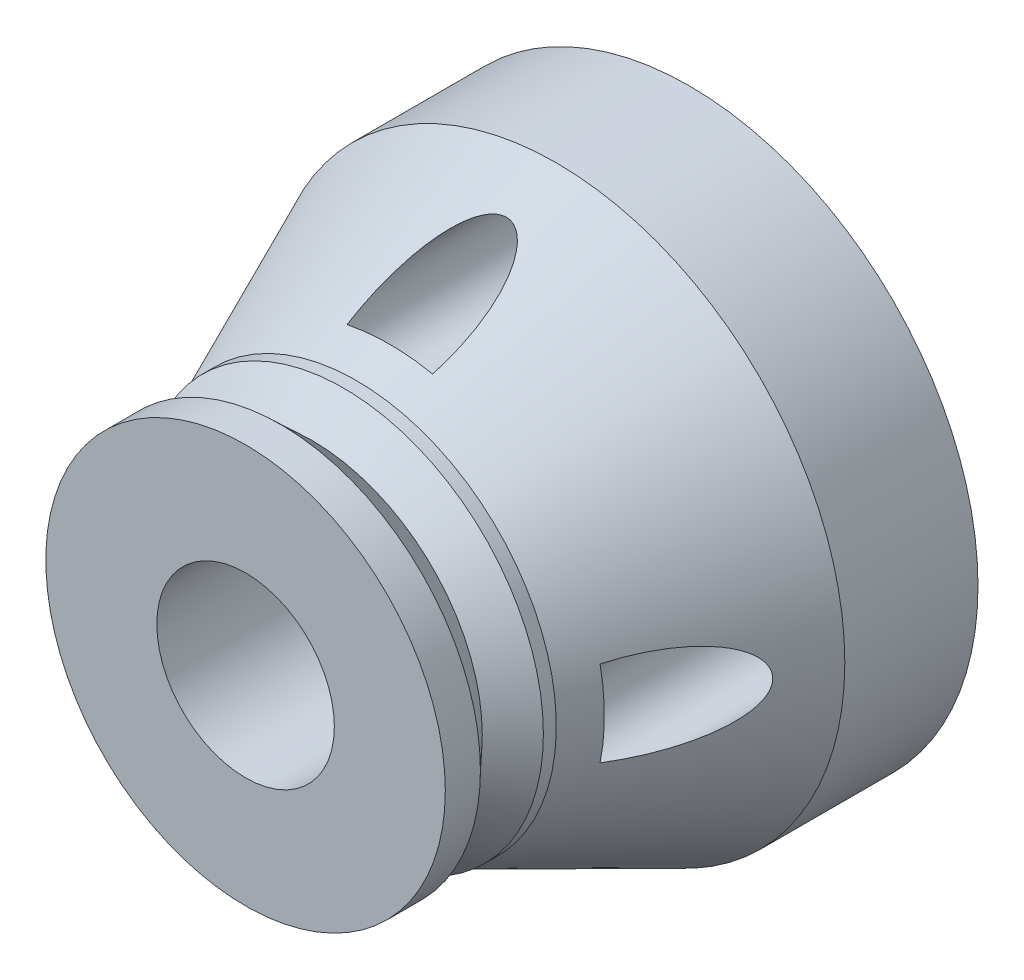
ISO-10303-21;
HEADER;
FILE_DESCRIPTION(('STEP AP214'),'2;1');
FILE_NAME('part.step','',(''),(''),'','','');
FILE_SCHEMA(('AUTOMOTIVE_DESIGN { 1 0 10303 214 1 1 1 1 }'));
ENDSEC;
DATA;
#1=APPLICATION_CONTEXT('core data for automotive mechanical design processes');
#2=APPLICATION_PROTOCOL_DEFINITION('international standard','automotive_design',2000,#1);
#3=PRODUCT_CONTEXT('',#1,'mechanical');
#4=PRODUCT('Part','Part','',(#3));
#5=PRODUCT_RELATED_PRODUCT_CATEGORY('part','',(#4));
#6=PRODUCT_DEFINITION_FORMATION('','',#4);
#7=PRODUCT_DEFINITION_CONTEXT('part definition',#1,'design');
#8=PRODUCT_DEFINITION('design','',#6,#7);
#9=PRODUCT_DEFINITION_SHAPE('','',#8);
#10=(LENGTH_UNIT() NAMED_UNIT(*) SI_UNIT(.MILLI.,.METRE.));
#11=(NAMED_UNIT(*) PLANE_ANGLE_UNIT() SI_UNIT($,.RADIAN.));
#12=(NAMED_UNIT(*) SI_UNIT($,.STERADIAN.) SOLID_ANGLE_UNIT());
#13=UNCERTAINTY_MEASURE_WITH_UNIT(LENGTH_MEASURE(1.E-05),#10,'distance_accuracy_value','');
#14=(GEOMETRIC_REPRESENTATION_CONTEXT(3) GLOBAL_UNCERTAINTY_ASSIGNED_CONTEXT((#13)) GLOBAL_UNIT_ASSIGNED_CONTEXT((#10,
#11,#12)) REPRESENTATION_CONTEXT('',''));
#15=CARTESIAN_POINT('',(0.,0.,0.));
#16=DIRECTION('',(0.,0.,1.));
#17=DIRECTION('',(1.,0.,0.));
#18=AXIS2_PLACEMENT_3D('',#15,#16,#17);
#19=CARTESIAN_POINT('',(0.,0.,20.));
#20=DIRECTION('',(0.,0.,-1.));
#21=DIRECTION('',(-1.,0.,0.));
#22=AXIS2_PLACEMENT_3D('',#19,#20,#21);
#23=CYLINDRICAL_SURFACE('',#22,9.);
#24=CARTESIAN_POINT('',(0.,0.,15.));
#25=DIRECTION('',(0.,0.,1.));
#26=DIRECTION('',(-1.,0.,0.));
#27=AXIS2_PLACEMENT_3D('',#24,#25,#26);
#28=CIRCLE('',#27,9.);
#29=CARTESIAN_POINT('',(-9.,0.,15.));
#30=VERTEX_POINT('',#29);
#31=EDGE_CURVE('E115',#30,#30,#28,.T.);
#32=ORIENTED_EDGE('',*,*,#31,.T.);
#33=EDGE_LOOP('',(#32));
#34=FACE_BOUND('',#33,.T.);
#35=CARTESIAN_POINT('',(0.,0.,15.5809551228105));
#36=DIRECTION('',(0.,0.,1.));
#37=DIRECTION('',(1.,0.,0.));
#38=AXIS2_PLACEMENT_3D('',#35,#36,#37);
#39=CIRCLE('',#38,9.);
#40=CARTESIAN_POINT('',(9.,0.,15.5809551228105));
#41=VERTEX_POINT('',#40);
#42=EDGE_CURVE('E137',#41,#41,#39,.T.);
#43=ORIENTED_EDGE('',*,*,#42,.F.);
#44=EDGE_LOOP('',(#43));
#45=FACE_BOUND('',#44,.T.);
#46=ADVANCED_FACE('F16',(#34,#45),#23,.T.);
#47=CARTESIAN_POINT('',(0.,0.,14.));
#48=DIRECTION('',(0.,0.,-1.));
#49=DIRECTION('',(-1.,0.,0.));
#50=AXIS2_PLACEMENT_3D('',#47,#48,#49);
#51=CYLINDRICAL_SURFACE('',#50,4.);
#52=CARTESIAN_POINT('',(0.,0.,20.));
#53=DIRECTION('',(0.,0.,1.));
#54=DIRECTION('',(1.,0.,0.));
#55=AXIS2_PLACEMENT_3D('',#52,#53,#54);
#56=CIRCLE('',#55,4.);
#57=CARTESIAN_POINT('',(4.,0.,20.));
#58=VERTEX_POINT('',#57);
#59=EDGE_CURVE('E146',#58,#58,#56,.T.);
#60=ORIENTED_EDGE('',*,*,#59,.T.);
#61=EDGE_LOOP('',(#60));
#62=FACE_BOUND('',#61,.T.);
#63=CARTESIAN_POINT('',(0.,0.,0.));
#64=DIRECTION('',(0.,0.,-1.));
#65=DIRECTION('',(-1.,0.,0.));
#66=AXIS2_PLACEMENT_3D('',#63,#64,#65);
#67=CIRCLE('',#66,4.);
#68=CARTESIAN_POINT('',(-4.,0.,0.));
#69=VERTEX_POINT('',#68);
#70=EDGE_CURVE('E131',#69,#69,#67,.T.);
#71=ORIENTED_EDGE('',*,*,#70,.T.);
#72=EDGE_LOOP('',(#71));
#73=FACE_BOUND('',#72,.T.);
#74=ADVANCED_FACE('F186',(#62,#73),#51,.F.);
#75=CARTESIAN_POINT('',(0.,0.,20.));
#76=DIRECTION('',(0.,0.,1.));
#77=DIRECTION('',(1.,0.,0.));
#78=AXIS2_PLACEMENT_3D('',#75,#76,#77);
#79=PLANE('',#78);
#80=CARTESIAN_POINT('',(0.,0.,20.));
#81=DIRECTION('',(0.,0.,1.));
#82=DIRECTION('',(1.,0.,0.));
#83=AXIS2_PLACEMENT_3D('',#80,#81,#82);
#84=CIRCLE('',#83,9.);
#85=CARTESIAN_POINT('',(9.,0.,20.));
#86=VERTEX_POINT('',#85);
#87=EDGE_CURVE('E149',#86,#86,#84,.T.);
#88=ORIENTED_EDGE('',*,*,#87,.T.);
#89=EDGE_LOOP('',(#88));
#90=FACE_BOUND('',#89,.T.);
#91=ORIENTED_EDGE('',*,*,#59,.F.);
#92=EDGE_LOOP('',(#91));
#93=FACE_BOUND('',#92,.T.);
#94=ADVANCED_FACE('F183',(#90,#93),#79,.T.);
#95=CARTESIAN_POINT('',(0.,0.,18.4190448771895));
#96=DIRECTION('',(0.,0.,1.));
#97=DIRECTION('',(1.,0.,0.));
#98=AXIS2_PLACEMENT_3D('',#95,#96,#97);
#99=CIRCLE('',#98,9.);
#100=CARTESIAN_POINT('',(9.,0.,18.4190448771895));
#101=VERTEX_POINT('',#100);
#102=EDGE_CURVE('E143',#101,#101,#99,.T.);
#103=ORIENTED_EDGE('',*,*,#102,.T.);
#104=EDGE_LOOP('',(#103));
#105=FACE_BOUND('',#104,.T.);
#106=ORIENTED_EDGE('',*,*,#87,.F.);
#107=EDGE_LOOP('',(#106));
#108=FACE_BOUND('',#107,.T.);
#109=ADVANCED_FACE('F172',(#105,#108),#23,.T.);
#110=CARTESIAN_POINT('',(0.,0.,17.));
#111=DIRECTION('',(0.,0.,1.));
#112=DIRECTION('',(1.,0.,0.));
#113=AXIS2_PLACEMENT_3D('',#110,#111,#112);
#114=CONICAL_SURFACE('',#113,7.66571260402316,0.754624281022991);
#115=ORIENTED_EDGE('',*,*,#102,.F.);
#116=EDGE_LOOP('',(#115));
#117=FACE_BOUND('',#116,.T.);
#118=CARTESIAN_POINT('',(0.,0.,17.));
#119=DIRECTION('',(0.,0.,1.));
#120=DIRECTION('',(1.,0.,0.));
#121=AXIS2_PLACEMENT_3D('',#118,#119,#120);
#122=CIRCLE('',#121,7.66571260402316);
#123=CARTESIAN_POINT('',(7.66571260402316,0.,17.));
#124=VERTEX_POINT('',#123);
#125=EDGE_CURVE('E140',#124,#124,#122,.T.);
#126=ORIENTED_EDGE('',*,*,#125,.T.);
#127=EDGE_LOOP('',(#126));
#128=FACE_BOUND('',#127,.T.);
#129=ADVANCED_FACE('F182',(#117,#128),#114,.T.);
#130=CARTESIAN_POINT('',(0.,0.,17.));
#131=DIRECTION('',(0.,0.,-1.));
#132=DIRECTION('',(-1.,0.,0.));
#133=AXIS2_PLACEMENT_3D('',#130,#131,#132);
#134=CONICAL_SURFACE('',#133,7.66571260402316,0.75462428102299);
#135=ORIENTED_EDGE('',*,*,#42,.T.);
#136=EDGE_LOOP('',(#135));
#137=FACE_BOUND('',#136,.T.);
#138=ORIENTED_EDGE('',*,*,#125,.F.);
#139=EDGE_LOOP('',(#138));
#140=FACE_BOUND('',#139,.T.);
#141=ADVANCED_FACE('F219',(#137,#140),#134,.T.);
#142=CARTESIAN_POINT('',(0.,0.,15.));
#143=DIRECTION('',(0.,0.,-1.));
#144=DIRECTION('',(-1.,0.,0.));
#145=AXIS2_PLACEMENT_3D('',#142,#143,#144);
#146=CONICAL_SURFACE('',#145,9.,0.41822432957923);
#147=CARTESIAN_POINT('',(-9.47213629669136,1.92908266041897,13.5002));
#148=CARTESIAN_POINT('',(-9.52473649047622,1.94346334146862,13.3777657835241));
#149=CARTESIAN_POINT('',(-9.57780513990623,1.9556845987492,13.2552781528122));
#150=CARTESIAN_POINT('',(-9.68482434017346,1.97576357206494,13.0103181597683));
#151=CARTESIAN_POINT('',(-9.73877496608749,1.98362091461691,12.8878457996397));
#152=CARTESIAN_POINT('',(-9.84767345007532,1.99494353712111,12.6426555988798));
#153=CARTESIAN_POINT('',(-9.90262401121699,1.99839423961274,12.5199382816445));
#154=CARTESIAN_POINT('',(-10.0132806859144,2.00072166018476,12.2748027086143));
#155=CARTESIAN_POINT('',(-10.0689867833824,1.99959847550577,12.1523844465168));
#156=CARTESIAN_POINT('',(-10.1832455198259,1.99244155482778,11.903271832506));
#157=CARTESIAN_POINT('',(-10.2418249814639,1.98621976620488,11.7765950138571));
#158=CARTESIAN_POINT('',(-10.3596123525782,1.96830588590379,11.5239234197692));
#159=CARTESIAN_POINT('',(-10.4188202351574,1.95661402743437,11.3979286154852));
#160=CARTESIAN_POINT('',(-10.5376560179445,1.92734698959602,11.1470253384006));
#161=CARTESIAN_POINT('',(-10.5972832453746,1.90977975205588,11.0221156314504));
#162=CARTESIAN_POINT('',(-10.7168526743657,1.86818885346455,10.7735465358464));
#163=CARTESIAN_POINT('',(-10.7767948101831,1.84416649133995,10.6498869008367));
#164=CARTESIAN_POINT('',(-10.895821223342,1.78933824061934,10.4061574462968));
#165=CARTESIAN_POINT('',(-10.9549041048382,1.75864542710925,10.2860617738155));
#166=CARTESIAN_POINT('',(-11.0728603908994,1.68927730360295,10.0479905098184));
#167=CARTESIAN_POINT('',(-11.1317336931868,1.65059852778669,9.93001586305095));
#168=CARTESIAN_POINT('',(-11.2481950352915,1.56435709456066,9.69822803646398));
#169=CARTESIAN_POINT('',(-11.3057899731648,1.51688240455001,9.58438595400764));
#170=CARTESIAN_POINT('',(-11.4194639962169,1.41108459848628,9.36113869318225));
#171=CARTESIAN_POINT('',(-11.4755448627089,1.3527749293427,9.25172821770451));
#172=CARTESIAN_POINT('',(-11.5664991734211,1.24468515001293,9.07533652514159));
#173=CARTESIAN_POINT('',(-11.6021541147488,1.19864598911261,9.00647540939957));
#174=CARTESIAN_POINT('',(-11.6716749298856,1.09962366576993,8.8727075928189));
#175=CARTESIAN_POINT('',(-11.7055381745218,1.04663067513272,8.80780668298745));
#176=CARTESIAN_POINT('',(-11.7707208439461,0.932162802551446,8.68330301131622));
#177=CARTESIAN_POINT('',(-11.8020176676278,0.870623251040002,8.62374695937737));
#178=CARTESIAN_POINT('',(-11.8601734028647,0.738213794988964,8.51340368043666));
#179=CARTESIAN_POINT('',(-11.8870415024298,0.667363769860519,8.4625982888582));
#180=CARTESIAN_POINT('',(-11.9262082941204,0.540865873428984,8.38869917384558));
#181=CARTESIAN_POINT('',(-11.9403876004409,0.487930332646808,8.36199579864061));
#182=CARTESIAN_POINT('',(-11.9647596177333,0.377994156843196,8.31614700858455));
#183=CARTESIAN_POINT('',(-11.9749563450703,0.320997686170875,8.29699397915208));
#184=CARTESIAN_POINT('',(-11.9905180097369,0.203419409952304,8.26778045335238));
#185=CARTESIAN_POINT('',(-11.9958353683702,0.14280831240306,8.25780948798194));
#186=CARTESIAN_POINT('',(-12.0008276501816,0.0205462996344253,8.24844771486375));
#187=CARTESIAN_POINT('',(-12.0005061629398,-0.0411039291212658,8.24905017627745));
#188=CARTESIAN_POINT('',(-11.9946512852575,-0.15578878453007,8.26003034904203));
#189=CARTESIAN_POINT('',(-11.9897430153285,-0.208975236135793,8.26923561503585));
#190=CARTESIAN_POINT('',(-11.9760508452498,-0.313020032738153,8.29493902959267));
#191=CARTESIAN_POINT('',(-11.9672647097614,-0.363877016256636,8.31144138446579));
#192=CARTESIAN_POINT('',(-11.9422923523073,-0.482154648310742,8.35840570897108));
#193=CARTESIAN_POINT('',(-11.9245519602722,-0.548068998621696,8.39181097867946));
#194=CARTESIAN_POINT('',(-11.8844843624069,-0.673095368548433,8.46744093444199));
#195=CARTESIAN_POINT('',(-11.8621461454097,-0.732190516812936,8.50968679664898));
#196=CARTESIAN_POINT('',(-11.8186532896501,-0.833644509294256,8.59216761916054));
#197=CARTESIAN_POINT('',(-11.7980236778966,-0.877091544412669,8.63136823595655));
#198=CARTESIAN_POINT('',(-11.7551621764256,-0.959990457769285,8.71300990234778));
#199=CARTESIAN_POINT('',(-11.7329292135309,-0.999439616806449,8.75545312347737));
#200=CARTESIAN_POINT('',(-11.664395055189,-1.11247084806638,8.88662375319143));
#201=CARTESIAN_POINT('',(-11.6163089240207,-1.18062626662499,8.97909686983508));
#202=CARTESIAN_POINT('',(-11.5185759671661,-1.30382544012265,9.16811722159313));
#203=CARTESIAN_POINT('',(-11.468983071735,-1.35911433938791,9.26453823141046));
#204=CARTESIAN_POINT('',(-11.3682865686911,-1.46044253723429,9.46146151564806));
#205=CARTESIAN_POINT('',(-11.3171815669533,-1.50647297431854,9.56196759044886));
#206=CARTESIAN_POINT('',(-11.2140501260743,-1.59076226453038,9.76602426111969));
#207=CARTESIAN_POINT('',(-11.1620217717198,-1.62900222284,9.86958157783398));
#208=CARTESIAN_POINT('',(-11.057602322605,-1.69864993482563,10.0787233062673));
#209=CARTESIAN_POINT('',(-11.0052113428781,-1.73005976112766,10.184307092434));
#210=CARTESIAN_POINT('',(-10.8986060605057,-1.7878207352804,10.4005345237049));
#211=CARTESIAN_POINT('',(-10.8443887237234,-1.81397038526644,10.5112300678452));
#212=CARTESIAN_POINT('',(-10.7360740632741,-1.86055507756505,10.7338847495242));
#213=CARTESIAN_POINT('',(-10.6819767655023,-1.88098898706777,10.8458441329769));
#214=CARTESIAN_POINT('',(-10.520035383632,-1.93456359518756,11.1833391253957));
#215=CARTESIAN_POINT('',(-10.4126180557402,-1.95993775350873,11.4103370561817));
#216=CARTESIAN_POINT('',(-10.1999107042333,-1.99288510318407,11.8663945917176));
#217=CARTESIAN_POINT('',(-10.0946199236495,-2.0004647435008,12.095453419351));
#218=CARTESIAN_POINT('',(-9.88671180808046,-1.99949169354139,12.5545773806742));
#219=CARTESIAN_POINT('',(-9.78409274799701,-1.99094968858286,12.7846417470717));
#220=CARTESIAN_POINT('',(-9.64744271389022,-1.96900877684204,13.0957646289874));
#221=CARTESIAN_POINT('',(-9.61206528034225,-1.96234605790908,13.1767543809806));
#222=CARTESIAN_POINT('',(-9.54177072528721,-1.94713044135078,13.3385688419931));
#223=CARTESIAN_POINT('',(-9.50685284688985,-1.9385812181592,13.4193935677455));
#224=CARTESIAN_POINT('',(-9.47213629669122,-1.9290826604197,13.5002));
#225=B_SPLINE_CURVE_WITH_KNOTS('',3,(#147,#148,#149,#150,#151,#152,#153,#154,#155,#156,#157,
#158,#159,#160,#161,#162,#163,#164,#165,#166,#167,#168,#169,#170,#171,#172,#173,#174,#175,#176,
#177,#178,#179,#180,#181,#182,#183,#184,#185,#186,#187,#188,#189,#190,#191,#192,#193,#194,#195,
#196,#197,#198,#199,#200,#201,#202,#203,#204,#205,#206,#207,#208,#209,#210,#211,#212,#213,#214,
#215,#216,#217,#218,#219,#220,#221,#222,#223,#224),.UNSPECIFIED.,.F.,.F.,(4,2,2,2,2,2,2,2,2,2,2,
2,2,2,2,2,2,2,2,2,2,2,2,2,2,2,2,2,2,2,2,2,2,2,2,2,2,2,4),(0.,0.402069490079374,
0.804173385747945,1.20760405122553,1.6110261398312,2.03003527799912,2.44902655392653,
2.86745374741731,3.28579680624577,3.69753567871157,4.10945361835485,4.51745492182395,
4.9249532108487,5.19521413766402,5.46586123681585,5.73868081700003,6.01092706976692,
6.19321593917098,6.37532049563957,6.55918244719644,6.74292736004653,6.90479441726102,
7.06675490247659,7.29346362271171,7.5207217322052,7.70660228053926,7.89260842088136,
8.26507846775127,8.62973187889038,8.99473266493116,9.36060844272475,9.72637303889315,
10.1042261298484,10.4821540550103,11.2385383939096,11.9946485670354,12.7502577714295,
13.0161329045261,13.2814946806138),.UNSPECIFIED.);
#226=CARTESIAN_POINT('',(-9.47222222222223,1.92910617055771,13.5));
#227=VERTEX_POINT('',#226);
#228=CARTESIAN_POINT('',(-9.47222222222208,-1.92910617055844,13.5));
#229=VERTEX_POINT('',#228);
#230=EDGE_CURVE('E59',#227,#229,#225,.T.);
#231=ORIENTED_EDGE('',*,*,#230,.F.);
#232=CARTESIAN_POINT('',(0.,0.,13.5));
#233=DIRECTION('',(0.,0.,-1.));
#234=DIRECTION('',(-1.,0.,0.));
#235=AXIS2_PLACEMENT_3D('',#232,#233,#234);
#236=CIRCLE('',#235,9.66666666666667);
#237=EDGE_CURVE('E11',#227,#229,#236,.F.);
#238=ORIENTED_EDGE('',*,*,#237,.T.);
#239=EDGE_LOOP('',(#231,#238));
#240=FACE_BOUND('',#239,.T.);
#241=CARTESIAN_POINT('',(1.92908266041901,9.47213629669136,13.5002));
#242=CARTESIAN_POINT('',(1.94346334146865,9.52473649047621,13.3777657835241));
#243=CARTESIAN_POINT('',(1.95568459874924,9.57780513990622,13.2552781528122));
#244=CARTESIAN_POINT('',(1.97576357206497,9.68482434017345,13.0103181597683));
#245=CARTESIAN_POINT('',(1.98362091461694,9.73877496608748,12.8878457996397));
#246=CARTESIAN_POINT('',(1.99494353712114,9.84767345007531,12.6426555988797));
#247=CARTESIAN_POINT('',(1.99839423961278,9.90262401121699,12.5199382816445));
#248=CARTESIAN_POINT('',(2.0007216601848,10.0132806859144,12.2748027086143));
#249=CARTESIAN_POINT('',(1.9995984755058,10.0689867833824,12.1523844465168));
#250=CARTESIAN_POINT('',(1.99244155482781,10.1832455198259,11.903271832506));
#251=CARTESIAN_POINT('',(1.98621976620491,10.2418249814639,11.7765950138571));
#252=CARTESIAN_POINT('',(1.96830588590383,10.3596123525782,11.5239234197692));
#253=CARTESIAN_POINT('',(1.95661402743441,10.4188202351574,11.3979286154852));
#254=CARTESIAN_POINT('',(1.92734698959605,10.5376560179445,11.1470253384006));
#255=CARTESIAN_POINT('',(1.90977975205591,10.5972832453746,11.0221156314504));
#256=CARTESIAN_POINT('',(1.86818885346459,10.7168526743657,10.7735465358464));
#257=CARTESIAN_POINT('',(1.84416649133999,10.7767948101831,10.6498869008367));
#258=CARTESIAN_POINT('',(1.78933824061938,10.895821223342,10.4061574462968));
#259=CARTESIAN_POINT('',(1.75864542710928,10.9549041048382,10.2860617738155));
#260=CARTESIAN_POINT('',(1.68927730360299,11.0728603908994,10.0479905098184));
#261=CARTESIAN_POINT('',(1.65059852778673,11.1317336931868,9.93001586305095));
#262=CARTESIAN_POINT('',(1.5643570945607,11.2481950352915,9.69822803646398));
#263=CARTESIAN_POINT('',(1.51688240455005,11.3057899731648,9.58438595400763));
#264=CARTESIAN_POINT('',(1.41108459848632,11.4194639962169,9.36113869318224));
#265=CARTESIAN_POINT('',(1.35277492934274,11.4755448627089,9.25172821770451));
#266=CARTESIAN_POINT('',(1.24468515001297,11.5664991734211,9.07533652514159));
#267=CARTESIAN_POINT('',(1.19864598911265,11.6021541147488,9.00647540939957));
#268=CARTESIAN_POINT('',(1.09962366576997,11.6716749298856,8.87270759281889));
#269=CARTESIAN_POINT('',(1.04663067513276,11.7055381745218,8.80780668298745));
#270=CARTESIAN_POINT('',(0.932162802551487,11.7707208439461,8.68330301131622));
#271=CARTESIAN_POINT('',(0.870623251040043,11.8020176676278,8.62374695937737));
#272=CARTESIAN_POINT('',(0.738213794989005,11.8601734028647,8.51340368043666));
#273=CARTESIAN_POINT('',(0.667363769860559,11.8870415024298,8.4625982888582));
#274=CARTESIAN_POINT('',(0.540865873429024,11.9262082941204,8.38869917384558));
#275=CARTESIAN_POINT('',(0.487930332646849,11.9403876004409,8.36199579864061));
#276=CARTESIAN_POINT('',(0.377994156843238,11.9647596177333,8.31614700858455));
#277=CARTESIAN_POINT('',(0.320997686170917,11.9749563450703,8.29699397915208));
#278=CARTESIAN_POINT('',(0.203419409952347,11.9905180097369,8.26778045335238));
#279=CARTESIAN_POINT('',(0.142808312403102,11.9958353683702,8.25780948798194));
#280=CARTESIAN_POINT('',(0.0205462996344667,12.0008276501816,8.24844771486375));
#281=CARTESIAN_POINT('',(-0.0411039291212244,12.0005061629398,8.24905017627745));
#282=CARTESIAN_POINT('',(-0.155788784530029,11.9946512852575,8.26003034904203));
#283=CARTESIAN_POINT('',(-0.208975236135752,11.9897430153285,8.26923561503585));
#284=CARTESIAN_POINT('',(-0.313020032738112,11.9760508452498,8.29493902959267));
#285=CARTESIAN_POINT('',(-0.363877016256595,11.9672647097614,8.31144138446579));
#286=CARTESIAN_POINT('',(-0.482154648310701,11.9422923523073,8.35840570897108));
#287=CARTESIAN_POINT('',(-0.548068998621655,11.9245519602722,8.39181097867946));
#288=CARTESIAN_POINT('',(-0.673095368548395,11.8844843624069,8.46744093444198));
#289=CARTESIAN_POINT('',(-0.732190516812898,11.8621461454097,8.50968679664898));
#290=CARTESIAN_POINT('',(-0.833644509294218,11.8186532896501,8.59216761916054));
#291=CARTESIAN_POINT('',(-0.877091544412629,11.7980236778966,8.63136823595655));
#292=CARTESIAN_POINT('',(-0.959990457769246,11.7551621764256,8.71300990234779));
#293=CARTESIAN_POINT('',(-0.999439616806411,11.7329292135309,8.75545312347737));
#294=CARTESIAN_POINT('',(-1.11247084806635,11.664395055189,8.88662375319143));
#295=CARTESIAN_POINT('',(-1.18062626662495,11.6163089240207,8.97909686983509));
#296=CARTESIAN_POINT('',(-1.30382544012261,11.5185759671661,9.16811722159314));
#297=CARTESIAN_POINT('',(-1.35911433938787,11.468983071735,9.26453823141047));
#298=CARTESIAN_POINT('',(-1.46044253723426,11.3682865686911,9.46146151564807));
#299=CARTESIAN_POINT('',(-1.50647297431851,11.3171815669533,9.56196759044887));
#300=CARTESIAN_POINT('',(-1.59076226453035,11.2140501260743,9.7660242611197));
#301=CARTESIAN_POINT('',(-1.62900222283997,11.1620217717198,9.86958157783399));
#302=CARTESIAN_POINT('',(-1.6986499348256,11.057602322605,10.0787233062674));
#303=CARTESIAN_POINT('',(-1.73005976112763,11.0052113428781,10.184307092434));
#304=CARTESIAN_POINT('',(-1.78782073528037,10.8986060605057,10.4005345237049));
#305=CARTESIAN_POINT('',(-1.81397038526641,10.8443887237234,10.5112300678452));
#306=CARTESIAN_POINT('',(-1.86055507756501,10.736074063274,10.7338847495242));
#307=CARTESIAN_POINT('',(-1.88098898706774,10.6819767655023,10.845844132977));
#308=CARTESIAN_POINT('',(-1.93456359518752,10.520035383632,11.1833391253958));
#309=CARTESIAN_POINT('',(-1.9599377535087,10.4126180557402,11.4103370561817));
#310=CARTESIAN_POINT('',(-1.99288510318404,10.1999107042333,11.8663945917176));
#311=CARTESIAN_POINT('',(-2.00046474350077,10.0946199236495,12.095453419351));
#312=CARTESIAN_POINT('',(-1.99949169354135,9.88671180808045,12.5545773806743));
#313=CARTESIAN_POINT('',(-1.99094968858282,9.78409274799699,12.7846417470717));
#314=CARTESIAN_POINT('',(-1.969008776842,9.64744271389021,13.0957646289874));
#315=CARTESIAN_POINT('',(-1.96234605790904,9.61206528034225,13.1767543809806));
#316=CARTESIAN_POINT('',(-1.94713044135075,9.54177072528721,13.3385688419931));
#317=CARTESIAN_POINT('',(-1.93858121815917,9.50685284688986,13.4193935677455));
#318=CARTESIAN_POINT('',(-1.92908266041967,9.47213629669122,13.5002));
#319=B_SPLINE_CURVE_WITH_KNOTS('',3,(#241,#242,#243,#244,#245,#246,#247,#248,#249,#250,#251,
#252,#253,#254,#255,#256,#257,#258,#259,#260,#261,#262,#263,#264,#265,#266,#267,#268,#269,#270,
#271,#272,#273,#274,#275,#276,#277,#278,#279,#280,#281,#282,#283,#284,#285,#286,#287,#288,#289,
#290,#291,#292,#293,#294,#295,#296,#297,#298,#299,#300,#301,#302,#303,#304,#305,#306,#307,#308,
#309,#310,#311,#312,#313,#314,#315,#316,#317,#318),.UNSPECIFIED.,.F.,.F.,(4,2,2,2,2,2,2,2,2,2,2,
2,2,2,2,2,2,2,2,2,2,2,2,2,2,2,2,2,2,2,2,2,2,2,2,2,2,2,4),(0.,0.402069490079377,
0.804173385747947,1.20760405122553,1.6110261398312,2.03003527799913,2.44902655392653,
2.86745374741731,3.28579680624577,3.69753567871158,4.10945361835485,4.51745492182395,
4.92495321084871,5.19521413766402,5.46586123681585,5.73868081700003,6.01092706976692,
6.19321593917098,6.37532049563957,6.55918244719644,6.74292736004653,6.90479441726103,
7.06675490247659,7.29346362271171,7.5207217322052,7.70660228053927,7.89260842088137,
8.26507846775129,8.6297318788904,8.99473266493118,9.36060844272478,9.72637303889317,
10.1042261298484,10.4821540550104,11.2385383939096,11.9946485670354,12.7502577714296,
13.0161329045261,13.2814946806138),.UNSPECIFIED.);
#320=CARTESIAN_POINT('',(1.92910617055774,9.47222222222222,13.5));
#321=VERTEX_POINT('',#320);
#322=CARTESIAN_POINT('',(-1.92910617055841,9.47222222222209,13.5));
#323=VERTEX_POINT('',#322);
#324=EDGE_CURVE('E64',#321,#323,#319,.T.);
#325=ORIENTED_EDGE('',*,*,#324,.F.);
#326=CARTESIAN_POINT('',(0.,0.,13.5));
#327=DIRECTION('',(0.,0.,-1.));
#328=DIRECTION('',(-1.,0.,0.));
#329=AXIS2_PLACEMENT_3D('',#326,#327,#328);
#330=CIRCLE('',#329,9.66666666666667);
#331=EDGE_CURVE('E24',#321,#323,#330,.F.);
#332=ORIENTED_EDGE('',*,*,#331,.T.);
#333=EDGE_LOOP('',(#325,#332));
#334=FACE_BOUND('',#333,.T.);
#335=CARTESIAN_POINT('',(9.47213629669135,-1.92908266041904,13.5002));
#336=CARTESIAN_POINT('',(9.52473649047621,-1.94346334146868,13.3777657835241));
#337=CARTESIAN_POINT('',(9.57780513990622,-1.95568459874927,13.2552781528122));
#338=CARTESIAN_POINT('',(9.68482434017344,-1.975763572065,13.0103181597683));
#339=CARTESIAN_POINT('',(9.73877496608748,-1.98362091461698,12.8878457996397));
#340=CARTESIAN_POINT('',(9.84767345007531,-1.99494353712117,12.6426555988798));
#341=CARTESIAN_POINT('',(9.90262401121698,-1.99839423961281,12.5199382816445));
#342=CARTESIAN_POINT('',(10.0132806859144,-2.00072166018483,12.2748027086143));
#343=CARTESIAN_POINT('',(10.0689867833824,-1.99959847550584,12.1523844465168));
#344=CARTESIAN_POINT('',(10.1832455198259,-1.99244155482785,11.903271832506));
#345=CARTESIAN_POINT('',(10.2418249814639,-1.98621976620495,11.7765950138571));
#346=CARTESIAN_POINT('',(10.3596123525782,-1.96830588590386,11.5239234197692));
#347=CARTESIAN_POINT('',(10.4188202351574,-1.95661402743445,11.3979286154852));
#348=CARTESIAN_POINT('',(10.5376560179445,-1.92734698959609,11.1470253384006));
#349=CARTESIAN_POINT('',(10.5972832453746,-1.90977975205595,11.0221156314504));
#350=CARTESIAN_POINT('',(10.7168526743657,-1.86818885346463,10.7735465358464));
#351=CARTESIAN_POINT('',(10.7767948101831,-1.84416649134002,10.6498869008367));
#352=CARTESIAN_POINT('',(10.895821223342,-1.78933824061942,10.4061574462968));
#353=CARTESIAN_POINT('',(10.9549041048382,-1.75864542710932,10.2860617738155));
#354=CARTESIAN_POINT('',(11.0728603908993,-1.68927730360303,10.0479905098184));
#355=CARTESIAN_POINT('',(11.1317336931868,-1.65059852778677,9.93001586305095));
#356=CARTESIAN_POINT('',(11.2481950352915,-1.56435709456074,9.69822803646398));
#357=CARTESIAN_POINT('',(11.3057899731648,-1.51688240455009,9.58438595400764));
#358=CARTESIAN_POINT('',(11.4194639962169,-1.41108459848636,9.36113869318225));
#359=CARTESIAN_POINT('',(11.4755448627089,-1.35277492934278,9.25172821770452));
#360=CARTESIAN_POINT('',(11.5664991734211,-1.24468515001302,9.07533652514159));
#361=CARTESIAN_POINT('',(11.6021541147488,-1.1986459891127,9.00647540939958));
#362=CARTESIAN_POINT('',(11.6716749298855,-1.09962366577001,8.8727075928189));
#363=CARTESIAN_POINT('',(11.7055381745218,-1.04663067513281,8.80780668298745));
#364=CARTESIAN_POINT('',(11.7707208439461,-0.932162802551533,8.68330301131622));
#365=CARTESIAN_POINT('',(11.8020176676278,-0.870623251040087,8.62374695937737));
#366=CARTESIAN_POINT('',(11.8601734028647,-0.738213794989047,8.51340368043665));
#367=CARTESIAN_POINT('',(11.8870415024298,-0.667363769860603,8.4625982888582));
#368=CARTESIAN_POINT('',(11.9262082941204,-0.540865873429068,8.38869917384558));
#369=CARTESIAN_POINT('',(11.9403876004409,-0.487930332646891,8.36199579864061));
#370=CARTESIAN_POINT('',(11.9647596177333,-0.377994156843279,8.31614700858455));
#371=CARTESIAN_POINT('',(11.9749563450703,-0.320997686170959,8.29699397915208));
#372=CARTESIAN_POINT('',(11.9905180097369,-0.203419409952388,8.26778045335238));
#373=CARTESIAN_POINT('',(11.9958353683702,-0.142808312403143,8.25780948798194));
#374=CARTESIAN_POINT('',(12.0008276501816,-0.0205462996345071,8.24844771486375));
#375=CARTESIAN_POINT('',(12.0005061629398,0.0411039291211838,8.24905017627745));
#376=CARTESIAN_POINT('',(11.9946512852575,0.155788784529987,8.26003034904203));
#377=CARTESIAN_POINT('',(11.9897430153285,0.20897523613571,8.26923561503585));
#378=CARTESIAN_POINT('',(11.9760508452498,0.31302003273807,8.29493902959267));
#379=CARTESIAN_POINT('',(11.9672647097614,0.363877016256553,8.31144138446579));
#380=CARTESIAN_POINT('',(11.9422923523073,0.48215464831066,8.35840570897108));
#381=CARTESIAN_POINT('',(11.9245519602722,0.548068998621615,8.39181097867946));
#382=CARTESIAN_POINT('',(11.8844843624069,0.673095368548355,8.46744093444198));
#383=CARTESIAN_POINT('',(11.8621461454097,0.732190516812857,8.50968679664898));
#384=CARTESIAN_POINT('',(11.8186532896501,0.833644509294177,8.59216761916054));
#385=CARTESIAN_POINT('',(11.7980236778967,0.877091544412589,8.63136823595655));
#386=CARTESIAN_POINT('',(11.7551621764256,0.959990457769206,8.71300990234779));
#387=CARTESIAN_POINT('',(11.7329292135309,0.999439616806372,8.75545312347738));
#388=CARTESIAN_POINT('',(11.664395055189,1.11247084806631,8.88662375319143));
#389=CARTESIAN_POINT('',(11.6163089240207,1.18062626662491,8.97909686983509));
#390=CARTESIAN_POINT('',(11.5185759671661,1.30382544012257,9.16811722159314));
#391=CARTESIAN_POINT('',(11.468983071735,1.35911433938783,9.26453823141047));
#392=CARTESIAN_POINT('',(11.3682865686911,1.46044253723422,9.46146151564808));
#393=CARTESIAN_POINT('',(11.3171815669533,1.50647297431847,9.56196759044887));
#394=CARTESIAN_POINT('',(11.2140501260743,1.59076226453031,9.7660242611197));
#395=CARTESIAN_POINT('',(11.1620217717198,1.62900222283993,9.86958157783399));
#396=CARTESIAN_POINT('',(11.057602322605,1.69864993482556,10.0787233062674));
#397=CARTESIAN_POINT('',(11.0052113428781,1.73005976112759,10.184307092434));
#398=CARTESIAN_POINT('',(10.8986060605057,1.78782073528033,10.4005345237049));
#399=CARTESIAN_POINT('',(10.8443887237234,1.81397038526637,10.5112300678452));
#400=CARTESIAN_POINT('',(10.7360740632741,1.86055507756497,10.7338847495242));
#401=CARTESIAN_POINT('',(10.6819767655023,1.8809889870677,10.845844132977));
#402=CARTESIAN_POINT('',(10.520035383632,1.93456359518749,11.1833391253958));
#403=CARTESIAN_POINT('',(10.4126180557402,1.95993775350866,11.4103370561817));
#404=CARTESIAN_POINT('',(10.1999107042333,1.992885103184,11.8663945917176));
#405=CARTESIAN_POINT('',(10.0946199236495,2.00046474350073,12.095453419351));
#406=CARTESIAN_POINT('',(9.88671180808046,1.99949169354132,12.5545773806743));
#407=CARTESIAN_POINT('',(9.784092747997,1.99094968858279,12.7846417470717));
#408=CARTESIAN_POINT('',(9.64744271389022,1.96900877684197,13.0957646289874));
#409=CARTESIAN_POINT('',(9.61206528034226,1.96234605790901,13.1767543809806));
#410=CARTESIAN_POINT('',(9.54177072528722,1.94713044135071,13.3385688419931));
#411=CARTESIAN_POINT('',(9.50685284688987,1.93858121815914,13.4193935677455));
#412=CARTESIAN_POINT('',(9.47213629669123,1.92908266041964,13.5002));
#413=B_SPLINE_CURVE_WITH_KNOTS('',3,(#335,#336,#337,#338,#339,#340,#341,#342,#343,#344,#345,
#346,#347,#348,#349,#350,#351,#352,#353,#354,#355,#356,#357,#358,#359,#360,#361,#362,#363,#364,
#365,#366,#367,#368,#369,#370,#371,#372,#373,#374,#375,#376,#377,#378,#379,#380,#381,#382,#383,
#384,#385,#386,#387,#388,#389,#390,#391,#392,#393,#394,#395,#396,#397,#398,#399,#400,#401,#402,
#403,#404,#405,#406,#407,#408,#409,#410,#411,#412),.UNSPECIFIED.,.F.,.F.,(4,2,2,2,2,2,2,2,2,2,2,
2,2,2,2,2,2,2,2,2,2,2,2,2,2,2,2,2,2,2,2,2,2,2,2,2,2,2,4),(0.,0.402069490079374,
0.804173385747945,1.20760405122553,1.6110261398312,2.03003527799913,2.44902655392653,
2.86745374741732,3.28579680624578,3.69753567871157,4.10945361835485,4.51745492182395,
4.9249532108487,5.19521413766402,5.46586123681585,5.73868081700003,6.01092706976692,
6.19321593917098,6.37532049563957,6.55918244719644,6.74292736004653,6.90479441726103,
7.06675490247659,7.29346362271171,7.5207217322052,7.70660228053927,7.89260842088137,
8.26507846775129,8.6297318788904,8.99473266493118,9.36060844272477,9.72637303889317,
10.1042261298484,10.4821540550104,11.2385383939096,11.9946485670354,12.7502577714295,
13.0161329045261,13.2814946806138),.UNSPECIFIED.);
#414=CARTESIAN_POINT('',(9.47222222222222,-1.92910617055777,13.5));
#415=VERTEX_POINT('',#414);
#416=CARTESIAN_POINT('',(9.4722222222221,1.92910617055837,13.5));
#417=VERTEX_POINT('',#416);
#418=EDGE_CURVE('E93',#415,#417,#413,.T.);
#419=ORIENTED_EDGE('',*,*,#418,.F.);
#420=CARTESIAN_POINT('',(0.,0.,13.5));
#421=DIRECTION('',(0.,0.,-1.));
#422=DIRECTION('',(-1.,0.,0.));
#423=AXIS2_PLACEMENT_3D('',#420,#421,#422);
#424=CIRCLE('',#423,9.66666666666667);
#425=EDGE_CURVE('E342',#415,#417,#424,.F.);
#426=ORIENTED_EDGE('',*,*,#425,.T.);
#427=EDGE_LOOP('',(#419,#426));
#428=FACE_BOUND('',#427,.T.);
#429=CARTESIAN_POINT('',(-1.92908266041907,-9.47213629669135,13.5002));
#430=CARTESIAN_POINT('',(-1.94346334146872,-9.5247364904762,13.3777657835241));
#431=CARTESIAN_POINT('',(-1.9556845987493,-9.57780513990621,13.2552781528122));
#432=CARTESIAN_POINT('',(-1.97576357206504,-9.68482434017344,13.0103181597683));
#433=CARTESIAN_POINT('',(-1.98362091461701,-9.73877496608747,12.8878457996397));
#434=CARTESIAN_POINT('',(-1.99494353712121,-9.8476734500753,12.6426555988797));
#435=CARTESIAN_POINT('',(-1.99839423961284,-9.90262401121698,12.5199382816445));
#436=CARTESIAN_POINT('',(-2.00072166018487,-10.0132806859144,12.2748027086143));
#437=CARTESIAN_POINT('',(-1.99959847550587,-10.0689867833824,12.1523844465168));
#438=CARTESIAN_POINT('',(-1.99244155482788,-10.1832455198259,11.903271832506));
#439=CARTESIAN_POINT('',(-1.98621976620498,-10.2418249814639,11.7765950138571));
#440=CARTESIAN_POINT('',(-1.9683058859039,-10.3596123525782,11.5239234197692));
#441=CARTESIAN_POINT('',(-1.95661402743448,-10.4188202351574,11.3979286154852));
#442=CARTESIAN_POINT('',(-1.92734698959613,-10.5376560179445,11.1470253384006));
#443=CARTESIAN_POINT('',(-1.90977975205599,-10.5972832453746,11.0221156314504));
#444=CARTESIAN_POINT('',(-1.86818885346467,-10.7168526743657,10.7735465358464));
#445=CARTESIAN_POINT('',(-1.84416649134006,-10.7767948101831,10.6498869008367));
#446=CARTESIAN_POINT('',(-1.78933824061946,-10.895821223342,10.4061574462968));
#447=CARTESIAN_POINT('',(-1.75864542710936,-10.9549041048382,10.2860617738155));
#448=CARTESIAN_POINT('',(-1.68927730360307,-11.0728603908993,10.0479905098184));
#449=CARTESIAN_POINT('',(-1.6505985277868,-11.1317336931868,9.93001586305095));
#450=CARTESIAN_POINT('',(-1.56435709456078,-11.2481950352915,9.69822803646398));
#451=CARTESIAN_POINT('',(-1.51688240455013,-11.3057899731648,9.58438595400764));
#452=CARTESIAN_POINT('',(-1.4110845984864,-11.4194639962169,9.36113869318225));
#453=CARTESIAN_POINT('',(-1.35277492934282,-11.4755448627089,9.25172821770452));
#454=CARTESIAN_POINT('',(-1.24468515001306,-11.5664991734211,9.0753365251416));
#455=CARTESIAN_POINT('',(-1.19864598911274,-11.6021541147488,9.00647540939958));
#456=CARTESIAN_POINT('',(-1.09962366577005,-11.6716749298855,8.8727075928189));
#457=CARTESIAN_POINT('',(-1.04663067513285,-11.7055381745218,8.80780668298745));
#458=CARTESIAN_POINT('',(-0.932162802551573,-11.7707208439461,8.68330301131621));
#459=CARTESIAN_POINT('',(-0.87062325104013,-11.8020176676278,8.62374695937737));
#460=CARTESIAN_POINT('',(-0.73821379498909,-11.8601734028647,8.51340368043666));
#461=CARTESIAN_POINT('',(-0.667363769860643,-11.8870415024298,8.4625982888582));
#462=CARTESIAN_POINT('',(-0.540865873429107,-11.9262082941204,8.38869917384558));
#463=CARTESIAN_POINT('',(-0.487930332646932,-11.9403876004409,8.36199579864061));
#464=CARTESIAN_POINT('',(-0.377994156843322,-11.9647596177333,8.31614700858455));
#465=CARTESIAN_POINT('',(-0.320997686171002,-11.9749563450703,8.29699397915208));
#466=CARTESIAN_POINT('',(-0.203419409952431,-11.9905180097369,8.26778045335238));
#467=CARTESIAN_POINT('',(-0.142808312403186,-11.9958353683702,8.25780948798194));
#468=CARTESIAN_POINT('',(-0.0205462996345512,-12.0008276501816,8.24844771486375));
#469=CARTESIAN_POINT('',(0.0411039291211395,-12.0005061629398,8.24905017627744));
#470=CARTESIAN_POINT('',(0.155788784529941,-11.9946512852575,8.26003034904202));
#471=CARTESIAN_POINT('',(0.208975236135663,-11.9897430153285,8.26923561503584));
#472=CARTESIAN_POINT('',(0.313020032738024,-11.9760508452498,8.29493902959267));
#473=CARTESIAN_POINT('',(0.363877016256508,-11.9672647097614,8.31144138446579));
#474=CARTESIAN_POINT('',(0.482154648310617,-11.9422923523073,8.35840570897107));
#475=CARTESIAN_POINT('',(0.548068998621571,-11.9245519602722,8.39181097867946));
#476=CARTESIAN_POINT('',(0.673095368548309,-11.8844843624069,8.46744093444199));
#477=CARTESIAN_POINT('',(0.73219051681281,-11.8621461454097,8.50968679664898));
#478=CARTESIAN_POINT('',(0.833644509294133,-11.8186532896501,8.59216761916053));
#479=CARTESIAN_POINT('',(0.877091544412548,-11.7980236778967,8.63136823595655));
#480=CARTESIAN_POINT('',(0.959990457769166,-11.7551621764256,8.71300990234779));
#481=CARTESIAN_POINT('',(0.999439616806328,-11.7329292135309,8.75545312347737));
#482=CARTESIAN_POINT('',(1.11247084806626,-11.664395055189,8.88662375319143));
#483=CARTESIAN_POINT('',(1.18062626662487,-11.6163089240207,8.97909686983508));
#484=CARTESIAN_POINT('',(1.30382544012253,-11.5185759671661,9.16811722159313));
#485=CARTESIAN_POINT('',(1.35911433938779,-11.468983071735,9.26453823141046));
#486=CARTESIAN_POINT('',(1.46044253723417,-11.3682865686911,9.46146151564806));
#487=CARTESIAN_POINT('',(1.50647297431842,-11.3171815669533,9.56196759044886));
#488=CARTESIAN_POINT('',(1.59076226453026,-11.2140501260743,9.76602426111969));
#489=CARTESIAN_POINT('',(1.62900222283988,-11.1620217717198,9.86958157783398));
#490=CARTESIAN_POINT('',(1.69864993482552,-11.057602322605,10.0787233062673));
#491=CARTESIAN_POINT('',(1.73005976112755,-11.0052113428781,10.184307092434));
#492=CARTESIAN_POINT('',(1.78782073528029,-10.8986060605057,10.4005345237049));
#493=CARTESIAN_POINT('',(1.81397038526633,-10.8443887237234,10.5112300678452));
#494=CARTESIAN_POINT('',(1.86055507756493,-10.7360740632741,10.7338847495242));
#495=CARTESIAN_POINT('',(1.88098898706766,-10.6819767655024,10.8458441329769));
#496=CARTESIAN_POINT('',(1.93456359518745,-10.5200353836321,11.1833391253957));
#497=CARTESIAN_POINT('',(1.95993775350862,-10.4126180557402,11.4103370561817));
#498=CARTESIAN_POINT('',(1.99288510318397,-10.1999107042333,11.8663945917176));
#499=CARTESIAN_POINT('',(2.0004647435007,-10.0946199236495,12.095453419351));
#500=CARTESIAN_POINT('',(1.99949169354129,-9.88671180808048,12.5545773806742));
#501=CARTESIAN_POINT('',(1.99094968858275,-9.78409274799703,12.7846417470717));
#502=CARTESIAN_POINT('',(1.96900877684193,-9.64744271389024,13.0957646289874));
#503=CARTESIAN_POINT('',(1.96234605790898,-9.61206528034227,13.1767543809806));
#504=CARTESIAN_POINT('',(1.94713044135068,-9.54177072528722,13.3385688419931));
#505=CARTESIAN_POINT('',(1.9385812181591,-9.50685284688987,13.4193935677455));
#506=CARTESIAN_POINT('',(1.9290826604196,-9.47213629669124,13.5002));
#507=B_SPLINE_CURVE_WITH_KNOTS('',3,(#429,#430,#431,#432,#433,#434,#435,#436,#437,#438,#439,
#440,#441,#442,#443,#444,#445,#446,#447,#448,#449,#450,#451,#452,#453,#454,#455,#456,#457,#458,
#459,#460,#461,#462,#463,#464,#465,#466,#467,#468,#469,#470,#471,#472,#473,#474,#475,#476,#477,
#478,#479,#480,#481,#482,#483,#484,#485,#486,#487,#488,#489,#490,#491,#492,#493,#494,#495,#496,
#497,#498,#499,#500,#501,#502,#503,#504,#505,#506),.UNSPECIFIED.,.F.,.F.,(4,2,2,2,2,2,2,2,2,2,2,
2,2,2,2,2,2,2,2,2,2,2,2,2,2,2,2,2,2,2,2,2,2,2,2,2,2,2,4),(0.,0.402069490079373,
0.804173385747944,1.20760405122553,1.6110261398312,2.03003527799912,2.44902655392653,
2.86745374741732,3.28579680624578,3.69753567871158,4.10945361835485,4.51745492182394,
4.9249532108487,5.19521413766401,5.46586123681584,5.73868081700002,6.01092706976692,
6.19321593917098,6.37532049563957,6.55918244719644,6.74292736004652,6.90479441726102,
7.06675490247659,7.29346362271171,7.5207217322052,7.70660228053927,7.89260842088137,
8.26507846775128,8.62973187889039,8.99473266493117,9.36060844272475,9.72637303889315,
10.1042261298484,10.4821540550103,11.2385383939096,11.9946485670354,12.7502577714295,
13.0161329045261,13.2814946806138),.UNSPECIFIED.);
#508=CARTESIAN_POINT('',(-1.92910617055781,-9.47222222222221,13.5));
#509=VERTEX_POINT('',#508);
#510=CARTESIAN_POINT('',(1.92910617055834,-9.4722222222221,13.5));
#511=VERTEX_POINT('',#510);
#512=EDGE_CURVE('E108',#509,#511,#507,.T.);
#513=ORIENTED_EDGE('',*,*,#512,.F.);
#514=CARTESIAN_POINT('',(0.,0.,13.5));
#515=DIRECTION('',(0.,0.,-1.));
#516=DIRECTION('',(-1.,0.,0.));
#517=AXIS2_PLACEMENT_3D('',#514,#515,#516);
#518=CIRCLE('',#517,9.66666666666667);
#519=EDGE_CURVE('E164',#509,#511,#518,.F.);
#520=ORIENTED_EDGE('',*,*,#519,.T.);
#521=EDGE_LOOP('',(#513,#520));
#522=FACE_BOUND('',#521,.T.);
#523=CARTESIAN_POINT('',(0.,0.,6.));
#524=DIRECTION('',(0.,0.,1.));
#525=DIRECTION('',(1.,0.,0.));
#526=AXIS2_PLACEMENT_3D('',#523,#524,#525);
#527=CIRCLE('',#526,13.);
#528=CARTESIAN_POINT('',(13.,0.,6.));
#529=VERTEX_POINT('',#528);
#530=EDGE_CURVE('E123',#529,#529,#527,.T.);
#531=ORIENTED_EDGE('',*,*,#530,.T.);
#532=EDGE_LOOP('',(#531));
#533=FACE_BOUND('',#532,.T.);
#534=ORIENTED_EDGE('',*,*,#31,.F.);
#535=EDGE_LOOP('',(#534));
#536=FACE_BOUND('',#535,.T.);
#537=ADVANCED_FACE('F61',(#240,#334,#428,#522,#533,#536),#146,.T.);
#538=CARTESIAN_POINT('',(0.,0.,6.));
#539=DIRECTION('',(0.,0.,-1.));
#540=DIRECTION('',(-1.,0.,0.));
#541=AXIS2_PLACEMENT_3D('',#538,#539,#540);
#542=CYLINDRICAL_SURFACE('',#541,13.);
#543=ORIENTED_EDGE('',*,*,#530,.F.);
#544=EDGE_LOOP('',(#543));
#545=FACE_BOUND('',#544,.T.);
#546=CARTESIAN_POINT('',(0.,0.,0.));
#547=DIRECTION('',(0.,0.,-1.));
#548=DIRECTION('',(-1.,0.,0.));
#549=AXIS2_PLACEMENT_3D('',#546,#547,#548);
#550=CIRCLE('',#549,13.);
#551=CARTESIAN_POINT('',(-13.,0.,0.));
#552=VERTEX_POINT('',#551);
#553=EDGE_CURVE('E134',#552,#552,#550,.T.);
#554=ORIENTED_EDGE('',*,*,#553,.F.);
#555=EDGE_LOOP('',(#554));
#556=FACE_BOUND('',#555,.T.);
#557=ADVANCED_FACE('F194',(#545,#556),#542,.T.);
#558=CARTESIAN_POINT('',(2.81767800705745E-13,-10.,0.));
#559=DIRECTION('',(0.,0.,1.));
#560=DIRECTION('',(1.,0.,0.));
#561=AXIS2_PLACEMENT_3D('',#558,#559,#560);
#562=CYLINDRICAL_SURFACE('',#561,2.00000000000033);
#563=CARTESIAN_POINT('',(2.81767800705745E-13,-10.,0.));
#564=DIRECTION('',(0.,0.,1.));
#565=DIRECTION('',(1.,0.,0.));
#566=AXIS2_PLACEMENT_3D('',#563,#564,#565);
#567=CIRCLE('',#566,2.00000000000033);
#568=CARTESIAN_POINT('',(2.00000000000062,-10.,0.));
#569=VERTEX_POINT('',#568);
#570=EDGE_CURVE('E152',#569,#569,#567,.T.);
#571=ORIENTED_EDGE('',*,*,#570,.F.);
#572=EDGE_LOOP('',(#571));
#573=FACE_BOUND('',#572,.T.);
#574=ORIENTED_EDGE('',*,*,#512,.T.);
#575=CARTESIAN_POINT('',(2.81767800705745E-13,-10.,13.5));
#576=DIRECTION('',(0.,0.,-1.));
#577=DIRECTION('',(-1.,0.,0.));
#578=AXIS2_PLACEMENT_3D('',#575,#576,#577);
#579=CIRCLE('',#578,2.00000000000033);
#580=EDGE_CURVE('E100',#509,#511,#579,.T.);
#581=ORIENTED_EDGE('',*,*,#580,.F.);
#582=EDGE_LOOP('',(#574,#581));
#583=FACE_BOUND('',#582,.T.);
#584=ADVANCED_FACE('F190',(#573,#583),#562,.F.);
#585=CARTESIAN_POINT('',(10.,0.,0.));
#586=DIRECTION('',(0.,0.,1.));
#587=DIRECTION('',(1.,0.,0.));
#588=AXIS2_PLACEMENT_3D('',#585,#586,#587);
#589=CYLINDRICAL_SURFACE('',#588,2.);
#590=CARTESIAN_POINT('',(10.,0.,0.));
#591=DIRECTION('',(0.,0.,1.));
#592=DIRECTION('',(1.,0.,0.));
#593=AXIS2_PLACEMENT_3D('',#590,#591,#592);
#594=CIRCLE('',#593,2.);
#595=CARTESIAN_POINT('',(12.,0.,0.));
#596=VERTEX_POINT('',#595);
#597=EDGE_CURVE('E155',#596,#596,#594,.T.);
#598=ORIENTED_EDGE('',*,*,#597,.F.);
#599=EDGE_LOOP('',(#598));
#600=FACE_BOUND('',#599,.T.);
#601=ORIENTED_EDGE('',*,*,#418,.T.);
#602=CARTESIAN_POINT('',(10.,3.16682614094176E-13,13.5));
#603=DIRECTION('',(0.,0.,-1.));
#604=DIRECTION('',(-1.,0.,0.));
#605=AXIS2_PLACEMENT_3D('',#602,#603,#604);
#606=CIRCLE('',#605,2.00000000000033);
#607=EDGE_CURVE('E91',#415,#417,#606,.T.);
#608=ORIENTED_EDGE('',*,*,#607,.F.);
#609=EDGE_LOOP('',(#601,#608));
#610=FACE_BOUND('',#609,.T.);
#611=ADVANCED_FACE('F193',(#600,#610),#589,.F.);
#612=CARTESIAN_POINT('',(-9.99999999999986,-1.39659253553725E-13,0.));
#613=DIRECTION('',(0.,0.,1.));
#614=DIRECTION('',(1.,0.,0.));
#615=AXIS2_PLACEMENT_3D('',#612,#613,#614);
#616=CYLINDRICAL_SURFACE('',#615,2.00000000000027);
#617=CARTESIAN_POINT('',(-9.99999999999986,-1.39659253553725E-13,0.));
#618=DIRECTION('',(0.,0.,1.));
#619=DIRECTION('',(1.,0.,0.));
#620=AXIS2_PLACEMENT_3D('',#617,#618,#619);
#621=CIRCLE('',#620,2.00000000000027);
#622=CARTESIAN_POINT('',(-7.99999999999958,-1.39659253553725E-13,0.));
#623=VERTEX_POINT('',#622);
#624=EDGE_CURVE('E158',#623,#623,#621,.T.);
#625=ORIENTED_EDGE('',*,*,#624,.F.);
#626=EDGE_LOOP('',(#625));
#627=FACE_BOUND('',#626,.T.);
#628=ORIENTED_EDGE('',*,*,#230,.T.);
#629=CARTESIAN_POINT('',(-10.,-3.86512240871039E-13,13.5));
#630=DIRECTION('',(0.,0.,-1.));
#631=DIRECTION('',(-1.,0.,0.));
#632=AXIS2_PLACEMENT_3D('',#629,#630,#631);
#633=CIRCLE('',#632,2.00000000000033);
#634=EDGE_CURVE('E30',#227,#229,#633,.T.);
#635=ORIENTED_EDGE('',*,*,#634,.F.);
#636=EDGE_LOOP('',(#628,#635));
#637=FACE_BOUND('',#636,.T.);
#638=ADVANCED_FACE('F58',(#627,#637),#616,.F.);
#639=CARTESIAN_POINT('',(0.,10.,0.));
#640=DIRECTION('',(0.,0.,1.));
#641=DIRECTION('',(1.,0.,0.));
#642=AXIS2_PLACEMENT_3D('',#639,#640,#641);
#643=CYLINDRICAL_SURFACE('',#642,2.);
#644=CARTESIAN_POINT('',(0.,10.,0.));
#645=DIRECTION('',(0.,0.,1.));
#646=DIRECTION('',(1.,0.,0.));
#647=AXIS2_PLACEMENT_3D('',#644,#645,#646);
#648=CIRCLE('',#647,2.);
#649=CARTESIAN_POINT('',(2.,10.,0.));
#650=VERTEX_POINT('',#649);
#651=EDGE_CURVE('E161',#650,#650,#648,.T.);
#652=ORIENTED_EDGE('',*,*,#651,.F.);
#653=EDGE_LOOP('',(#652));
#654=FACE_BOUND('',#653,.T.);
#655=ORIENTED_EDGE('',*,*,#324,.T.);
#656=CARTESIAN_POINT('',(-3.51597427482608E-13,10.,13.5));
#657=DIRECTION('',(0.,0.,-1.));
#658=DIRECTION('',(-1.,0.,0.));
#659=AXIS2_PLACEMENT_3D('',#656,#657,#658);
#660=CIRCLE('',#659,2.00000000000033);
#661=EDGE_CURVE('E37',#321,#323,#660,.T.);
#662=ORIENTED_EDGE('',*,*,#661,.F.);
#663=EDGE_LOOP('',(#655,#662));
#664=FACE_BOUND('',#663,.T.);
#665=ADVANCED_FACE('F200',(#654,#664),#643,.F.);
#666=CARTESIAN_POINT('',(0.,0.,0.));
#667=DIRECTION('',(0.,0.,1.));
#668=DIRECTION('',(1.,0.,0.));
#669=AXIS2_PLACEMENT_3D('',#666,#667,#668);
#670=PLANE('',#669);
#671=ORIENTED_EDGE('',*,*,#70,.F.);
#672=EDGE_LOOP('',(#671));
#673=FACE_BOUND('',#672,.T.);
#674=ORIENTED_EDGE('',*,*,#651,.T.);
#675=EDGE_LOOP('',(#674));
#676=FACE_BOUND('',#675,.T.);
#677=ORIENTED_EDGE('',*,*,#624,.T.);
#678=EDGE_LOOP('',(#677));
#679=FACE_BOUND('',#678,.T.);
#680=ORIENTED_EDGE('',*,*,#597,.T.);
#681=EDGE_LOOP('',(#680));
#682=FACE_BOUND('',#681,.T.);
#683=ORIENTED_EDGE('',*,*,#570,.T.);
#684=EDGE_LOOP('',(#683));
#685=FACE_BOUND('',#684,.T.);
#686=ORIENTED_EDGE('',*,*,#553,.T.);
#687=EDGE_LOOP('',(#686));
#688=FACE_BOUND('',#687,.T.);
#689=ADVANCED_FACE('F18',(#673,#676,#679,#682,#685,#688),#670,.F.);
#690=CARTESIAN_POINT('',(2.81767800705745E-13,-10.,13.5));
#691=DIRECTION('',(0.,0.,-1.));
#692=DIRECTION('',(-1.,0.,0.));
#693=AXIS2_PLACEMENT_3D('',#690,#691,#692);
#694=PLANE('',#693);
#695=ORIENTED_EDGE('',*,*,#580,.T.);
#696=ORIENTED_EDGE('',*,*,#519,.F.);
#697=EDGE_LOOP('',(#695,#696));
#698=FACE_BOUND('',#697,.T.);
#699=ADVANCED_FACE('F104',(#698),#694,.T.);
#700=CARTESIAN_POINT('',(10.,3.16682614094176E-13,13.5));
#701=DIRECTION('',(0.,0.,-1.));
#702=DIRECTION('',(-1.,0.,0.));
#703=AXIS2_PLACEMENT_3D('',#700,#701,#702);
#704=PLANE('',#703);
#705=ORIENTED_EDGE('',*,*,#607,.T.);
#706=ORIENTED_EDGE('',*,*,#425,.F.);
#707=EDGE_LOOP('',(#705,#706));
#708=FACE_BOUND('',#707,.T.);
#709=ADVANCED_FACE('F82',(#708),#704,.T.);
#710=CARTESIAN_POINT('',(-3.51597427482608E-13,10.,13.5));
#711=DIRECTION('',(0.,0.,-1.));
#712=DIRECTION('',(-1.,0.,0.));
#713=AXIS2_PLACEMENT_3D('',#710,#711,#712);
#714=PLANE('',#713);
#715=ORIENTED_EDGE('',*,*,#661,.T.);
#716=ORIENTED_EDGE('',*,*,#331,.F.);
#717=EDGE_LOOP('',(#715,#716));
#718=FACE_BOUND('',#717,.T.);
#719=ADVANCED_FACE('F79',(#718),#714,.T.);
#720=CARTESIAN_POINT('',(-10.,-3.86512240871039E-13,13.5));
#721=DIRECTION('',(0.,0.,-1.));
#722=DIRECTION('',(-1.,0.,0.));
#723=AXIS2_PLACEMENT_3D('',#720,#721,#722);
#724=PLANE('',#723);
#725=ORIENTED_EDGE('',*,*,#634,.T.);
#726=ORIENTED_EDGE('',*,*,#237,.F.);
#727=EDGE_LOOP('',(#725,#726));
#728=FACE_BOUND('',#727,.T.);
#729=ADVANCED_FACE('F54',(#728),#724,.T.);
#730=CLOSED_SHELL('',(#46,#74,#94,#109,#129,#141,#537,#557,#584,#611,#638,#665,#689,#699,#709,
#719,#729));
#731=MANIFOLD_SOLID_BREP('B1',#730);
#732=ADVANCED_BREP_SHAPE_REPRESENTATION('',(#18,#731),#14);
#733=SHAPE_DEFINITION_REPRESENTATION(#9,#732);
ENDSEC;
END-ISO-10303-21;
